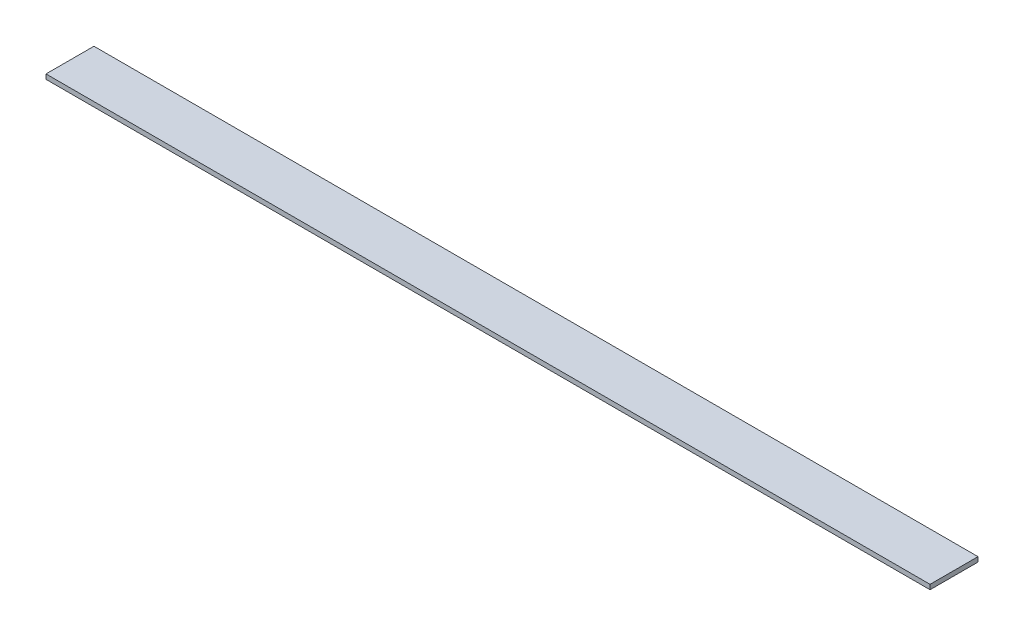
ISO-10303-21;
HEADER;
FILE_DESCRIPTION(('STEP AP214'),'2;1');
FILE_NAME('part.step','',(''),(''),'','','');
FILE_SCHEMA(('AUTOMOTIVE_DESIGN { 1 0 10303 214 1 1 1 1 }'));
ENDSEC;
DATA;
#1=APPLICATION_CONTEXT('core data for automotive mechanical design processes');
#2=APPLICATION_PROTOCOL_DEFINITION('international standard','automotive_design',2000,#1);
#3=PRODUCT_CONTEXT('',#1,'mechanical');
#4=PRODUCT('Part','Part','',(#3));
#5=PRODUCT_RELATED_PRODUCT_CATEGORY('part','',(#4));
#6=PRODUCT_DEFINITION_FORMATION('','',#4);
#7=PRODUCT_DEFINITION_CONTEXT('part definition',#1,'design');
#8=PRODUCT_DEFINITION('design','',#6,#7);
#9=PRODUCT_DEFINITION_SHAPE('','',#8);
#10=(LENGTH_UNIT() NAMED_UNIT(*) SI_UNIT(.MILLI.,.METRE.));
#11=(NAMED_UNIT(*) PLANE_ANGLE_UNIT() SI_UNIT($,.RADIAN.));
#12=(NAMED_UNIT(*) SI_UNIT($,.STERADIAN.) SOLID_ANGLE_UNIT());
#13=UNCERTAINTY_MEASURE_WITH_UNIT(LENGTH_MEASURE(1.E-05),#10,'distance_accuracy_value','');
#14=(GEOMETRIC_REPRESENTATION_CONTEXT(3) GLOBAL_UNCERTAINTY_ASSIGNED_CONTEXT((#13)) GLOBAL_UNIT_ASSIGNED_CONTEXT((#10,
#11,#12)) REPRESENTATION_CONTEXT('',''));
#15=CARTESIAN_POINT('',(0.,0.,0.));
#16=DIRECTION('',(0.,0.,1.));
#17=DIRECTION('',(1.,0.,0.));
#18=AXIS2_PLACEMENT_3D('',#15,#16,#17);
#19=CARTESIAN_POINT('',(936.625,10.,-50.8));
#20=DIRECTION('',(-1.,0.,0.));
#21=DIRECTION('',(0.,0.,1.));
#22=AXIS2_PLACEMENT_3D('',#19,#20,#21);
#23=PLANE('',#22);
#24=DIRECTION('',(0.,0.,-1.));
#25=VECTOR('',#24,1.);
#26=CARTESIAN_POINT('',(936.625,0.,-50.8));
#27=LINE('',#26,#25);
#28=CARTESIAN_POINT('',(936.625,0.,50.8));
#29=VERTEX_POINT('',#28);
#30=CARTESIAN_POINT('',(936.625,0.,-50.8));
#31=VERTEX_POINT('',#30);
#32=EDGE_CURVE('E96',#29,#31,#27,.T.);
#33=ORIENTED_EDGE('',*,*,#32,.T.);
#34=DIRECTION('',(0.,-1.,0.));
#35=VECTOR('',#34,1.);
#36=CARTESIAN_POINT('',(936.625,10.,-50.8));
#37=LINE('',#36,#35);
#38=CARTESIAN_POINT('',(936.625,10.,-50.8));
#39=VERTEX_POINT('',#38);
#40=EDGE_CURVE('E11',#39,#31,#37,.T.);
#41=ORIENTED_EDGE('',*,*,#40,.F.);
#42=DIRECTION('',(0.,0.,-1.));
#43=VECTOR('',#42,1.);
#44=CARTESIAN_POINT('',(936.625,10.,-50.8));
#45=LINE('',#44,#43);
#46=CARTESIAN_POINT('',(936.625,10.,50.8));
#47=VERTEX_POINT('',#46);
#48=EDGE_CURVE('E84',#47,#39,#45,.T.);
#49=ORIENTED_EDGE('',*,*,#48,.F.);
#50=DIRECTION('',(0.,-1.,0.));
#51=VECTOR('',#50,1.);
#52=CARTESIAN_POINT('',(936.625,10.,50.8));
#53=LINE('',#52,#51);
#54=EDGE_CURVE('E92',#47,#29,#53,.T.);
#55=ORIENTED_EDGE('',*,*,#54,.T.);
#56=EDGE_LOOP('',(#33,#41,#49,#55));
#57=FACE_BOUND('',#56,.T.);
#58=ADVANCED_FACE('F33',(#57),#23,.F.);
#59=CARTESIAN_POINT('',(-936.625,10.,-50.8));
#60=DIRECTION('',(0.,0.,1.));
#61=DIRECTION('',(1.,0.,0.));
#62=AXIS2_PLACEMENT_3D('',#59,#60,#61);
#63=PLANE('',#62);
#64=DIRECTION('',(-1.,0.,0.));
#65=VECTOR('',#64,1.);
#66=CARTESIAN_POINT('',(-936.625,0.,-50.8));
#67=LINE('',#66,#65);
#68=CARTESIAN_POINT('',(-936.625,0.,-50.8));
#69=VERTEX_POINT('',#68);
#70=EDGE_CURVE('E88',#31,#69,#67,.T.);
#71=ORIENTED_EDGE('',*,*,#70,.T.);
#72=DIRECTION('',(0.,-1.,0.));
#73=VECTOR('',#72,1.);
#74=CARTESIAN_POINT('',(-936.625,10.,-50.8));
#75=LINE('',#74,#73);
#76=CARTESIAN_POINT('',(-936.625,10.,-50.8));
#77=VERTEX_POINT('',#76);
#78=EDGE_CURVE('E41',#77,#69,#75,.T.);
#79=ORIENTED_EDGE('',*,*,#78,.F.);
#80=DIRECTION('',(-1.,0.,0.));
#81=VECTOR('',#80,1.);
#82=CARTESIAN_POINT('',(-936.625,10.,-50.8));
#83=LINE('',#82,#81);
#84=EDGE_CURVE('E79',#39,#77,#83,.T.);
#85=ORIENTED_EDGE('',*,*,#84,.F.);
#86=ORIENTED_EDGE('',*,*,#40,.T.);
#87=EDGE_LOOP('',(#71,#79,#85,#86));
#88=FACE_BOUND('',#87,.T.);
#89=ADVANCED_FACE('F87',(#88),#63,.F.);
#90=CARTESIAN_POINT('',(-936.625,10.,-50.8));
#91=DIRECTION('',(1.,0.,0.));
#92=DIRECTION('',(0.,0.,-1.));
#93=AXIS2_PLACEMENT_3D('',#90,#91,#92);
#94=PLANE('',#93);
#95=DIRECTION('',(0.,0.,1.));
#96=VECTOR('',#95,1.);
#97=CARTESIAN_POINT('',(-936.625,0.,-50.8));
#98=LINE('',#97,#96);
#99=CARTESIAN_POINT('',(-936.625,0.,50.8));
#100=VERTEX_POINT('',#99);
#101=EDGE_CURVE('E66',#69,#100,#98,.T.);
#102=ORIENTED_EDGE('',*,*,#101,.T.);
#103=DIRECTION('',(0.,-1.,0.));
#104=VECTOR('',#103,1.);
#105=CARTESIAN_POINT('',(-936.625,10.,50.8));
#106=LINE('',#105,#104);
#107=CARTESIAN_POINT('',(-936.625,10.,50.8));
#108=VERTEX_POINT('',#107);
#109=EDGE_CURVE('E89',#108,#100,#106,.T.);
#110=ORIENTED_EDGE('',*,*,#109,.F.);
#111=DIRECTION('',(0.,0.,1.));
#112=VECTOR('',#111,1.);
#113=CARTESIAN_POINT('',(-936.625,10.,-50.8));
#114=LINE('',#113,#112);
#115=EDGE_CURVE('E82',#77,#108,#114,.T.);
#116=ORIENTED_EDGE('',*,*,#115,.F.);
#117=ORIENTED_EDGE('',*,*,#78,.T.);
#118=EDGE_LOOP('',(#102,#110,#116,#117));
#119=FACE_BOUND('',#118,.T.);
#120=ADVANCED_FACE('F90',(#119),#94,.F.);
#121=CARTESIAN_POINT('',(-936.625,10.,50.8));
#122=DIRECTION('',(0.,0.,-1.));
#123=DIRECTION('',(-1.,0.,0.));
#124=AXIS2_PLACEMENT_3D('',#121,#122,#123);
#125=PLANE('',#124);
#126=DIRECTION('',(1.,0.,0.));
#127=VECTOR('',#126,1.);
#128=CARTESIAN_POINT('',(-936.625,0.,50.8));
#129=LINE('',#128,#127);
#130=EDGE_CURVE('E72',#100,#29,#129,.T.);
#131=ORIENTED_EDGE('',*,*,#130,.T.);
#132=ORIENTED_EDGE('',*,*,#54,.F.);
#133=DIRECTION('',(1.,0.,0.));
#134=VECTOR('',#133,1.);
#135=CARTESIAN_POINT('',(-936.625,10.,50.8));
#136=LINE('',#135,#134);
#137=EDGE_CURVE('E49',#108,#47,#136,.T.);
#138=ORIENTED_EDGE('',*,*,#137,.F.);
#139=ORIENTED_EDGE('',*,*,#109,.T.);
#140=EDGE_LOOP('',(#131,#132,#138,#139));
#141=FACE_BOUND('',#140,.T.);
#142=ADVANCED_FACE('F103',(#141),#125,.F.);
#143=CARTESIAN_POINT('',(936.625,10.,50.8));
#144=DIRECTION('',(0.,1.,0.));
#145=DIRECTION('',(0.,0.,1.));
#146=AXIS2_PLACEMENT_3D('',#143,#144,#145);
#147=PLANE('',#146);
#148=ORIENTED_EDGE('',*,*,#48,.T.);
#149=ORIENTED_EDGE('',*,*,#84,.T.);
#150=ORIENTED_EDGE('',*,*,#115,.T.);
#151=ORIENTED_EDGE('',*,*,#137,.T.);
#152=EDGE_LOOP('',(#148,#149,#150,#151));
#153=FACE_BOUND('',#152,.T.);
#154=ADVANCED_FACE('F80',(#153),#147,.T.);
#155=CARTESIAN_POINT('',(936.625,0.,50.8));
#156=DIRECTION('',(0.,1.,0.));
#157=DIRECTION('',(0.,0.,1.));
#158=AXIS2_PLACEMENT_3D('',#155,#156,#157);
#159=PLANE('',#158);
#160=ORIENTED_EDGE('',*,*,#32,.F.);
#161=ORIENTED_EDGE('',*,*,#130,.F.);
#162=ORIENTED_EDGE('',*,*,#101,.F.);
#163=ORIENTED_EDGE('',*,*,#70,.F.);
#164=EDGE_LOOP('',(#160,#161,#162,#163));
#165=FACE_BOUND('',#164,.T.);
#166=ADVANCED_FACE('F106',(#165),#159,.F.);
#167=CLOSED_SHELL('',(#58,#89,#120,#142,#154,#166));
#168=MANIFOLD_SOLID_BREP('B2',#167);
#169=ADVANCED_BREP_SHAPE_REPRESENTATION('',(#18,#168),#14);
#170=SHAPE_DEFINITION_REPRESENTATION(#9,#169);
ENDSEC;
END-ISO-10303-21;
